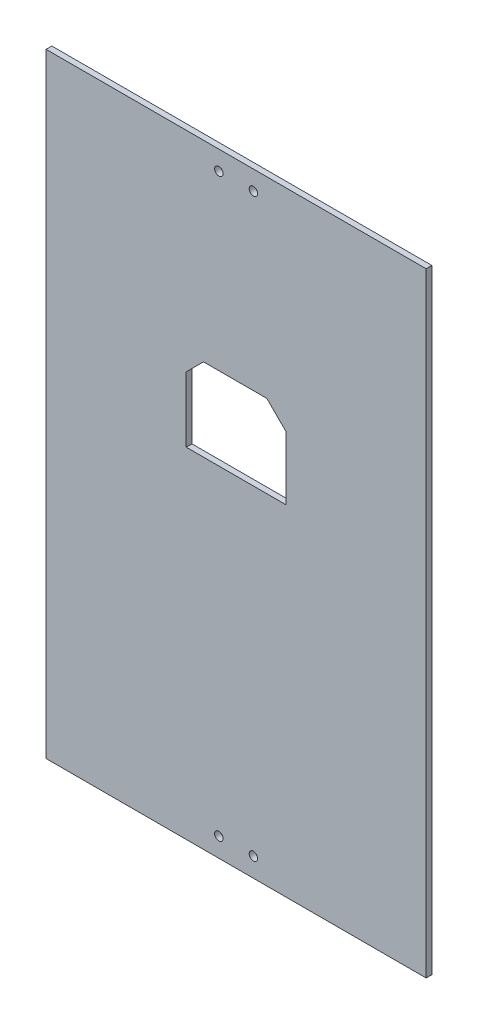
ISO-10303-21;
HEADER;
FILE_DESCRIPTION(('STEP AP214'),'2;1');
FILE_NAME('part.step','',(''),(''),'','','');
FILE_SCHEMA(('AUTOMOTIVE_DESIGN { 1 0 10303 214 1 1 1 1 }'));
ENDSEC;
DATA;
#1=APPLICATION_CONTEXT('core data for automotive mechanical design processes');
#2=APPLICATION_PROTOCOL_DEFINITION('international standard','automotive_design',2000,#1);
#3=PRODUCT_CONTEXT('',#1,'mechanical');
#4=PRODUCT('Part','Part','',(#3));
#5=PRODUCT_RELATED_PRODUCT_CATEGORY('part','',(#4));
#6=PRODUCT_DEFINITION_FORMATION('','',#4);
#7=PRODUCT_DEFINITION_CONTEXT('part definition',#1,'design');
#8=PRODUCT_DEFINITION('design','',#6,#7);
#9=PRODUCT_DEFINITION_SHAPE('','',#8);
#10=(LENGTH_UNIT() NAMED_UNIT(*) SI_UNIT(.MILLI.,.METRE.));
#11=(NAMED_UNIT(*) PLANE_ANGLE_UNIT() SI_UNIT($,.RADIAN.));
#12=(NAMED_UNIT(*) SI_UNIT($,.STERADIAN.) SOLID_ANGLE_UNIT());
#13=UNCERTAINTY_MEASURE_WITH_UNIT(LENGTH_MEASURE(1.E-05),#10,'distance_accuracy_value','');
#14=(GEOMETRIC_REPRESENTATION_CONTEXT(3) GLOBAL_UNCERTAINTY_ASSIGNED_CONTEXT((#13)) GLOBAL_UNIT_ASSIGNED_CONTEXT((#10,
#11,#12)) REPRESENTATION_CONTEXT('',''));
#15=CARTESIAN_POINT('',(0.,0.,0.));
#16=DIRECTION('',(0.,0.,1.));
#17=DIRECTION('',(1.,0.,0.));
#18=AXIS2_PLACEMENT_3D('',#15,#16,#17);
#19=CARTESIAN_POINT('',(-99.,165.,3.));
#20=DIRECTION('',(1.,0.,0.));
#21=DIRECTION('',(0.,1.,0.));
#22=AXIS2_PLACEMENT_3D('',#19,#20,#21);
#23=PLANE('',#22);
#24=DIRECTION('',(0.,-1.,0.));
#25=VECTOR('',#24,1.);
#26=CARTESIAN_POINT('',(-99.,165.,0.));
#27=LINE('',#26,#25);
#28=CARTESIAN_POINT('',(-99.,165.,0.));
#29=VERTEX_POINT('',#28);
#30=CARTESIAN_POINT('',(-99.,-155.,0.));
#31=VERTEX_POINT('',#30);
#32=EDGE_CURVE('E182',#29,#31,#27,.T.);
#33=ORIENTED_EDGE('',*,*,#32,.T.);
#34=DIRECTION('',(0.,0.,-1.));
#35=VECTOR('',#34,1.);
#36=CARTESIAN_POINT('',(-99.,-155.,3.));
#37=LINE('',#36,#35);
#38=CARTESIAN_POINT('',(-99.,-155.,3.));
#39=VERTEX_POINT('',#38);
#40=EDGE_CURVE('E11',#39,#31,#37,.T.);
#41=ORIENTED_EDGE('',*,*,#40,.F.);
#42=DIRECTION('',(0.,-1.,0.));
#43=VECTOR('',#42,1.);
#44=CARTESIAN_POINT('',(-99.,165.,3.));
#45=LINE('',#44,#43);
#46=CARTESIAN_POINT('',(-99.,165.,3.));
#47=VERTEX_POINT('',#46);
#48=EDGE_CURVE('E185',#47,#39,#45,.T.);
#49=ORIENTED_EDGE('',*,*,#48,.F.);
#50=DIRECTION('',(0.,0.,-1.));
#51=VECTOR('',#50,1.);
#52=CARTESIAN_POINT('',(-99.,165.,3.));
#53=LINE('',#52,#51);
#54=EDGE_CURVE('E195',#47,#29,#53,.T.);
#55=ORIENTED_EDGE('',*,*,#54,.T.);
#56=EDGE_LOOP('',(#33,#41,#49,#55));
#57=FACE_BOUND('',#56,.T.);
#58=ADVANCED_FACE('F39',(#57),#23,.F.);
#59=CARTESIAN_POINT('',(99.,-155.,3.));
#60=DIRECTION('',(0.,1.,0.));
#61=DIRECTION('',(-1.,0.,0.));
#62=AXIS2_PLACEMENT_3D('',#59,#60,#61);
#63=PLANE('',#62);
#64=DIRECTION('',(1.,0.,0.));
#65=VECTOR('',#64,1.);
#66=CARTESIAN_POINT('',(99.,-155.,0.));
#67=LINE('',#66,#65);
#68=CARTESIAN_POINT('',(99.,-155.,0.));
#69=VERTEX_POINT('',#68);
#70=EDGE_CURVE('E198',#31,#69,#67,.T.);
#71=ORIENTED_EDGE('',*,*,#70,.T.);
#72=DIRECTION('',(0.,0.,-1.));
#73=VECTOR('',#72,1.);
#74=CARTESIAN_POINT('',(99.,-155.,3.));
#75=LINE('',#74,#73);
#76=CARTESIAN_POINT('',(99.,-155.,3.));
#77=VERTEX_POINT('',#76);
#78=EDGE_CURVE('E46',#77,#69,#75,.T.);
#79=ORIENTED_EDGE('',*,*,#78,.F.);
#80=DIRECTION('',(1.,0.,0.));
#81=VECTOR('',#80,1.);
#82=CARTESIAN_POINT('',(99.,-155.,3.));
#83=LINE('',#82,#81);
#84=EDGE_CURVE('E188',#39,#77,#83,.T.);
#85=ORIENTED_EDGE('',*,*,#84,.F.);
#86=ORIENTED_EDGE('',*,*,#40,.T.);
#87=EDGE_LOOP('',(#71,#79,#85,#86));
#88=FACE_BOUND('',#87,.T.);
#89=ADVANCED_FACE('F227',(#88),#63,.F.);
#90=CARTESIAN_POINT('',(99.,165.,3.));
#91=DIRECTION('',(-1.,0.,0.));
#92=DIRECTION('',(0.,-1.,0.));
#93=AXIS2_PLACEMENT_3D('',#90,#91,#92);
#94=PLANE('',#93);
#95=DIRECTION('',(0.,1.,0.));
#96=VECTOR('',#95,1.);
#97=CARTESIAN_POINT('',(99.,165.,0.));
#98=LINE('',#97,#96);
#99=CARTESIAN_POINT('',(99.,165.,0.));
#100=VERTEX_POINT('',#99);
#101=EDGE_CURVE('E200',#69,#100,#98,.T.);
#102=ORIENTED_EDGE('',*,*,#101,.T.);
#103=DIRECTION('',(0.,0.,-1.));
#104=VECTOR('',#103,1.);
#105=CARTESIAN_POINT('',(99.,165.,3.));
#106=LINE('',#105,#104);
#107=CARTESIAN_POINT('',(99.,165.,3.));
#108=VERTEX_POINT('',#107);
#109=EDGE_CURVE('E205',#108,#100,#106,.T.);
#110=ORIENTED_EDGE('',*,*,#109,.F.);
#111=DIRECTION('',(0.,1.,0.));
#112=VECTOR('',#111,1.);
#113=CARTESIAN_POINT('',(99.,165.,3.));
#114=LINE('',#113,#112);
#115=EDGE_CURVE('E191',#77,#108,#114,.T.);
#116=ORIENTED_EDGE('',*,*,#115,.F.);
#117=ORIENTED_EDGE('',*,*,#78,.T.);
#118=EDGE_LOOP('',(#102,#110,#116,#117));
#119=FACE_BOUND('',#118,.T.);
#120=ADVANCED_FACE('F212',(#119),#94,.F.);
#121=CARTESIAN_POINT('',(-99.,165.,3.));
#122=DIRECTION('',(0.,-1.,0.));
#123=DIRECTION('',(0.,0.,-1.));
#124=AXIS2_PLACEMENT_3D('',#121,#122,#123);
#125=PLANE('',#124);
#126=DIRECTION('',(-1.,0.,0.));
#127=VECTOR('',#126,1.);
#128=CARTESIAN_POINT('',(-99.,165.,0.));
#129=LINE('',#128,#127);
#130=EDGE_CURVE('E189',#100,#29,#129,.T.);
#131=ORIENTED_EDGE('',*,*,#130,.T.);
#132=ORIENTED_EDGE('',*,*,#54,.F.);
#133=DIRECTION('',(-1.,0.,0.));
#134=VECTOR('',#133,1.);
#135=CARTESIAN_POINT('',(-99.,165.,3.));
#136=LINE('',#135,#134);
#137=EDGE_CURVE('E193',#108,#47,#136,.T.);
#138=ORIENTED_EDGE('',*,*,#137,.F.);
#139=ORIENTED_EDGE('',*,*,#109,.T.);
#140=EDGE_LOOP('',(#131,#132,#138,#139));
#141=FACE_BOUND('',#140,.T.);
#142=ADVANCED_FACE('F220',(#141),#125,.F.);
#143=CARTESIAN_POINT('',(0.,0.,3.));
#144=DIRECTION('',(0.,0.,-1.));
#145=DIRECTION('',(-1.,0.,0.));
#146=AXIS2_PLACEMENT_3D('',#143,#144,#145);
#147=PLANE('',#146);
#148=DIRECTION('',(1.,0.,0.));
#149=VECTOR('',#148,1.);
#150=CARTESIAN_POINT('',(0.,22.,3.));
#151=LINE('',#150,#149);
#152=CARTESIAN_POINT('',(-26.,22.,3.));
#153=VERTEX_POINT('',#152);
#154=CARTESIAN_POINT('',(26.,22.,3.));
#155=VERTEX_POINT('',#154);
#156=EDGE_CURVE('E133',#153,#155,#151,.T.);
#157=ORIENTED_EDGE('',*,*,#156,.F.);
#158=DIRECTION('',(0.,-1.,0.));
#159=VECTOR('',#158,1.);
#160=CARTESIAN_POINT('',(-26.,22.,3.));
#161=LINE('',#160,#159);
#162=CARTESIAN_POINT('',(-26.,56.,3.));
#163=VERTEX_POINT('',#162);
#164=EDGE_CURVE('E53',#163,#153,#161,.T.);
#165=ORIENTED_EDGE('',*,*,#164,.F.);
#166=DIRECTION('',(-0.707106781186548,-0.707106781186547,0.));
#167=VECTOR('',#166,1.);
#168=CARTESIAN_POINT('',(-17.,65.,3.));
#169=LINE('',#168,#167);
#170=CARTESIAN_POINT('',(-17.,65.,3.));
#171=VERTEX_POINT('',#170);
#172=EDGE_CURVE('E149',#171,#163,#169,.T.);
#173=ORIENTED_EDGE('',*,*,#172,.F.);
#174=DIRECTION('',(-1.,0.,0.));
#175=VECTOR('',#174,1.);
#176=CARTESIAN_POINT('',(16.,65.,3.));
#177=LINE('',#176,#175);
#178=CARTESIAN_POINT('',(16.,65.,3.));
#179=VERTEX_POINT('',#178);
#180=EDGE_CURVE('E146',#179,#171,#177,.T.);
#181=ORIENTED_EDGE('',*,*,#180,.F.);
#182=DIRECTION('',(-0.707106781186547,0.707106781186547,0.));
#183=VECTOR('',#182,1.);
#184=CARTESIAN_POINT('',(26.,55.,3.));
#185=LINE('',#184,#183);
#186=CARTESIAN_POINT('',(26.,55.,3.));
#187=VERTEX_POINT('',#186);
#188=EDGE_CURVE('E143',#187,#179,#185,.T.);
#189=ORIENTED_EDGE('',*,*,#188,.F.);
#190=DIRECTION('',(0.,1.,0.));
#191=VECTOR('',#190,1.);
#192=CARTESIAN_POINT('',(26.,22.,3.));
#193=LINE('',#192,#191);
#194=EDGE_CURVE('E135',#155,#187,#193,.T.);
#195=ORIENTED_EDGE('',*,*,#194,.F.);
#196=EDGE_LOOP('',(#157,#165,#173,#181,#189,#195));
#197=FACE_BOUND('',#196,.T.);
#198=CARTESIAN_POINT('',(9.,155.,3.));
#199=DIRECTION('',(0.,0.,1.));
#200=DIRECTION('',(1.,0.,0.));
#201=AXIS2_PLACEMENT_3D('',#198,#199,#200);
#202=CIRCLE('',#201,2.2);
#203=CARTESIAN_POINT('',(11.2,155.,3.));
#204=VERTEX_POINT('',#203);
#205=EDGE_CURVE('E174',#204,#204,#202,.T.);
#206=ORIENTED_EDGE('',*,*,#205,.F.);
#207=EDGE_LOOP('',(#206));
#208=FACE_BOUND('',#207,.T.);
#209=CARTESIAN_POINT('',(-9.,155.,3.));
#210=DIRECTION('',(0.,0.,1.));
#211=DIRECTION('',(1.,0.,0.));
#212=AXIS2_PLACEMENT_3D('',#209,#210,#211);
#213=CIRCLE('',#212,2.2);
#214=CARTESIAN_POINT('',(-6.8,155.,3.));
#215=VERTEX_POINT('',#214);
#216=EDGE_CURVE('E168',#215,#215,#213,.T.);
#217=ORIENTED_EDGE('',*,*,#216,.F.);
#218=EDGE_LOOP('',(#217));
#219=FACE_BOUND('',#218,.T.);
#220=CARTESIAN_POINT('',(-9.,-145.,3.));
#221=DIRECTION('',(0.,0.,1.));
#222=DIRECTION('',(1.,0.,0.));
#223=AXIS2_PLACEMENT_3D('',#220,#221,#222);
#224=CIRCLE('',#223,2.2);
#225=CARTESIAN_POINT('',(-6.8,-145.,3.));
#226=VERTEX_POINT('',#225);
#227=EDGE_CURVE('E161',#226,#226,#224,.T.);
#228=ORIENTED_EDGE('',*,*,#227,.F.);
#229=EDGE_LOOP('',(#228));
#230=FACE_BOUND('',#229,.T.);
#231=CARTESIAN_POINT('',(9.,-145.,3.));
#232=DIRECTION('',(0.,0.,1.));
#233=DIRECTION('',(1.,0.,0.));
#234=AXIS2_PLACEMENT_3D('',#231,#232,#233);
#235=CIRCLE('',#234,2.2);
#236=CARTESIAN_POINT('',(11.2,-145.,3.));
#237=VERTEX_POINT('',#236);
#238=EDGE_CURVE('E179',#237,#237,#235,.T.);
#239=ORIENTED_EDGE('',*,*,#238,.F.);
#240=EDGE_LOOP('',(#239));
#241=FACE_BOUND('',#240,.T.);
#242=ORIENTED_EDGE('',*,*,#48,.T.);
#243=ORIENTED_EDGE('',*,*,#84,.T.);
#244=ORIENTED_EDGE('',*,*,#115,.T.);
#245=ORIENTED_EDGE('',*,*,#137,.T.);
#246=EDGE_LOOP('',(#242,#243,#244,#245));
#247=FACE_BOUND('',#246,.T.);
#248=ADVANCED_FACE('F226',(#197,#208,#219,#230,#241,#247),#147,.F.);
#249=CARTESIAN_POINT('',(0.,0.,0.));
#250=DIRECTION('',(0.,0.,-1.));
#251=DIRECTION('',(-1.,0.,0.));
#252=AXIS2_PLACEMENT_3D('',#249,#250,#251);
#253=PLANE('',#252);
#254=DIRECTION('',(0.,-1.,0.));
#255=VECTOR('',#254,1.);
#256=CARTESIAN_POINT('',(-26.,22.,0.));
#257=LINE('',#256,#255);
#258=CARTESIAN_POINT('',(-26.,56.,0.));
#259=VERTEX_POINT('',#258);
#260=CARTESIAN_POINT('',(-26.,22.,0.));
#261=VERTEX_POINT('',#260);
#262=EDGE_CURVE('E124',#259,#261,#257,.T.);
#263=ORIENTED_EDGE('',*,*,#262,.T.);
#264=DIRECTION('',(1.,0.,0.));
#265=VECTOR('',#264,1.);
#266=CARTESIAN_POINT('',(0.,22.,0.));
#267=LINE('',#266,#265);
#268=CARTESIAN_POINT('',(26.,22.,0.));
#269=VERTEX_POINT('',#268);
#270=EDGE_CURVE('E114',#261,#269,#267,.T.);
#271=ORIENTED_EDGE('',*,*,#270,.T.);
#272=DIRECTION('',(0.,1.,0.));
#273=VECTOR('',#272,1.);
#274=CARTESIAN_POINT('',(26.,22.,0.));
#275=LINE('',#274,#273);
#276=CARTESIAN_POINT('',(26.,55.,0.));
#277=VERTEX_POINT('',#276);
#278=EDGE_CURVE('E386',#269,#277,#275,.T.);
#279=ORIENTED_EDGE('',*,*,#278,.T.);
#280=DIRECTION('',(-0.707106781186548,0.707106781186548,0.));
#281=VECTOR('',#280,1.);
#282=CARTESIAN_POINT('',(26.,55.,0.));
#283=LINE('',#282,#281);
#284=CARTESIAN_POINT('',(16.,65.,0.));
#285=VERTEX_POINT('',#284);
#286=EDGE_CURVE('E388',#277,#285,#283,.T.);
#287=ORIENTED_EDGE('',*,*,#286,.T.);
#288=DIRECTION('',(-1.,0.,0.));
#289=VECTOR('',#288,1.);
#290=CARTESIAN_POINT('',(16.,65.,0.));
#291=LINE('',#290,#289);
#292=CARTESIAN_POINT('',(-17.,65.,0.));
#293=VERTEX_POINT('',#292);
#294=EDGE_CURVE('E137',#285,#293,#291,.T.);
#295=ORIENTED_EDGE('',*,*,#294,.T.);
#296=DIRECTION('',(-0.707106781186548,-0.707106781186547,0.));
#297=VECTOR('',#296,1.);
#298=CARTESIAN_POINT('',(-17.,65.,0.));
#299=LINE('',#298,#297);
#300=EDGE_CURVE('E132',#293,#259,#299,.T.);
#301=ORIENTED_EDGE('',*,*,#300,.T.);
#302=EDGE_LOOP('',(#263,#271,#279,#287,#295,#301));
#303=FACE_BOUND('',#302,.T.);
#304=CARTESIAN_POINT('',(9.,155.,0.));
#305=DIRECTION('',(0.,0.,-1.));
#306=DIRECTION('',(-1.,0.,0.));
#307=AXIS2_PLACEMENT_3D('',#304,#305,#306);
#308=CIRCLE('',#307,2.2);
#309=CARTESIAN_POINT('',(11.2,155.,0.));
#310=VERTEX_POINT('',#309);
#311=EDGE_CURVE('E121',#310,#310,#308,.F.);
#312=ORIENTED_EDGE('',*,*,#311,.T.);
#313=EDGE_LOOP('',(#312));
#314=FACE_BOUND('',#313,.T.);
#315=CARTESIAN_POINT('',(-9.,155.,0.));
#316=DIRECTION('',(0.,0.,-1.));
#317=DIRECTION('',(-1.,0.,0.));
#318=AXIS2_PLACEMENT_3D('',#315,#316,#317);
#319=CIRCLE('',#318,2.2);
#320=CARTESIAN_POINT('',(-6.8,155.,0.));
#321=VERTEX_POINT('',#320);
#322=EDGE_CURVE('E171',#321,#321,#319,.F.);
#323=ORIENTED_EDGE('',*,*,#322,.T.);
#324=EDGE_LOOP('',(#323));
#325=FACE_BOUND('',#324,.T.);
#326=CARTESIAN_POINT('',(-9.,-145.,0.));
#327=DIRECTION('',(0.,0.,-1.));
#328=DIRECTION('',(-1.,0.,0.));
#329=AXIS2_PLACEMENT_3D('',#326,#327,#328);
#330=CIRCLE('',#329,2.2);
#331=CARTESIAN_POINT('',(-6.8,-145.,0.));
#332=VERTEX_POINT('',#331);
#333=EDGE_CURVE('E165',#332,#332,#330,.F.);
#334=ORIENTED_EDGE('',*,*,#333,.T.);
#335=EDGE_LOOP('',(#334));
#336=FACE_BOUND('',#335,.T.);
#337=CARTESIAN_POINT('',(9.,-145.,0.));
#338=DIRECTION('',(0.,0.,-1.));
#339=DIRECTION('',(-1.,0.,0.));
#340=AXIS2_PLACEMENT_3D('',#337,#338,#339);
#341=CIRCLE('',#340,2.2);
#342=CARTESIAN_POINT('',(11.2,-145.,0.));
#343=VERTEX_POINT('',#342);
#344=EDGE_CURVE('E164',#343,#343,#341,.F.);
#345=ORIENTED_EDGE('',*,*,#344,.T.);
#346=EDGE_LOOP('',(#345));
#347=FACE_BOUND('',#346,.T.);
#348=ORIENTED_EDGE('',*,*,#32,.F.);
#349=ORIENTED_EDGE('',*,*,#130,.F.);
#350=ORIENTED_EDGE('',*,*,#101,.F.);
#351=ORIENTED_EDGE('',*,*,#70,.F.);
#352=EDGE_LOOP('',(#348,#349,#350,#351));
#353=FACE_BOUND('',#352,.T.);
#354=ADVANCED_FACE('F129',(#303,#314,#325,#336,#347,#353),#253,.T.);
#355=CARTESIAN_POINT('',(9.,-145.,-0.00100000000000013));
#356=DIRECTION('',(0.,0.,1.));
#357=DIRECTION('',(1.,0.,0.));
#358=AXIS2_PLACEMENT_3D('',#355,#356,#357);
#359=CYLINDRICAL_SURFACE('',#358,2.2);
#360=CARTESIAN_POINT('',(11.2,-145.,0.));
#361=CARTESIAN_POINT('',(11.2,-145.,0.03125));
#362=CARTESIAN_POINT('',(11.2,-145.,0.0625));
#363=CARTESIAN_POINT('',(11.2,-145.,0.125));
#364=CARTESIAN_POINT('',(11.2,-145.,0.15625));
#365=CARTESIAN_POINT('',(11.2,-145.,0.21875));
#366=CARTESIAN_POINT('',(11.2,-145.,0.25));
#367=CARTESIAN_POINT('',(11.2,-145.,0.3125));
#368=CARTESIAN_POINT('',(11.2,-145.,0.34375));
#369=CARTESIAN_POINT('',(11.2,-145.,0.40625));
#370=CARTESIAN_POINT('',(11.2,-145.,0.4375));
#371=CARTESIAN_POINT('',(11.2,-145.,0.5));
#372=CARTESIAN_POINT('',(11.2,-145.,0.53125));
#373=CARTESIAN_POINT('',(11.2,-145.,0.59375));
#374=CARTESIAN_POINT('',(11.2,-145.,0.625));
#375=CARTESIAN_POINT('',(11.2,-145.,0.6875));
#376=CARTESIAN_POINT('',(11.2,-145.,0.71875));
#377=CARTESIAN_POINT('',(11.2,-145.,0.78125));
#378=CARTESIAN_POINT('',(11.2,-145.,0.8125));
#379=CARTESIAN_POINT('',(11.2,-145.,0.875));
#380=CARTESIAN_POINT('',(11.2,-145.,0.90625));
#381=CARTESIAN_POINT('',(11.2,-145.,0.96875));
#382=CARTESIAN_POINT('',(11.2,-145.,1.));
#383=CARTESIAN_POINT('',(11.2,-145.,1.0625));
#384=CARTESIAN_POINT('',(11.2,-145.,1.09375));
#385=CARTESIAN_POINT('',(11.2,-145.,1.15625));
#386=CARTESIAN_POINT('',(11.2,-145.,1.1875));
#387=CARTESIAN_POINT('',(11.2,-145.,1.25));
#388=CARTESIAN_POINT('',(11.2,-145.,1.28125));
#389=CARTESIAN_POINT('',(11.2,-145.,1.34375));
#390=CARTESIAN_POINT('',(11.2,-145.,1.375));
#391=CARTESIAN_POINT('',(11.2,-145.,1.4375));
#392=CARTESIAN_POINT('',(11.2,-145.,1.46875));
#393=CARTESIAN_POINT('',(11.2,-145.,1.53125));
#394=CARTESIAN_POINT('',(11.2,-145.,1.5625));
#395=CARTESIAN_POINT('',(11.2,-145.,1.625));
#396=CARTESIAN_POINT('',(11.2,-145.,1.65625));
#397=CARTESIAN_POINT('',(11.2,-145.,1.71875));
#398=CARTESIAN_POINT('',(11.2,-145.,1.75));
#399=CARTESIAN_POINT('',(11.2,-145.,1.8125));
#400=CARTESIAN_POINT('',(11.2,-145.,1.84375));
#401=CARTESIAN_POINT('',(11.2,-145.,1.90625));
#402=CARTESIAN_POINT('',(11.2,-145.,1.9375));
#403=CARTESIAN_POINT('',(11.2,-145.,2.));
#404=CARTESIAN_POINT('',(11.2,-145.,2.03125));
#405=CARTESIAN_POINT('',(11.2,-145.,2.09375));
#406=CARTESIAN_POINT('',(11.2,-145.,2.125));
#407=CARTESIAN_POINT('',(11.2,-145.,2.1875));
#408=CARTESIAN_POINT('',(11.2,-145.,2.21875));
#409=CARTESIAN_POINT('',(11.2,-145.,2.28125));
#410=CARTESIAN_POINT('',(11.2,-145.,2.3125));
#411=CARTESIAN_POINT('',(11.2,-145.,2.375));
#412=CARTESIAN_POINT('',(11.2,-145.,2.40625));
#413=CARTESIAN_POINT('',(11.2,-145.,2.46875));
#414=CARTESIAN_POINT('',(11.2,-145.,2.5));
#415=CARTESIAN_POINT('',(11.2,-145.,2.5625));
#416=CARTESIAN_POINT('',(11.2,-145.,2.59375));
#417=CARTESIAN_POINT('',(11.2,-145.,2.65625));
#418=CARTESIAN_POINT('',(11.2,-145.,2.6875));
#419=CARTESIAN_POINT('',(11.2,-145.,2.75));
#420=CARTESIAN_POINT('',(11.2,-145.,2.78125));
#421=CARTESIAN_POINT('',(11.2,-145.,2.84375));
#422=CARTESIAN_POINT('',(11.2,-145.,2.875));
#423=CARTESIAN_POINT('',(11.2,-145.,2.9375));
#424=CARTESIAN_POINT('',(11.2,-145.,2.96875));
#425=CARTESIAN_POINT('',(11.2,-145.,3.));
#426=B_SPLINE_CURVE_WITH_KNOTS('',3,(#360,#361,#362,#363,#364,#365,#366,#367,#368,#369,#370,
#371,#372,#373,#374,#375,#376,#377,#378,#379,#380,#381,#382,#383,#384,#385,#386,#387,#388,#389,
#390,#391,#392,#393,#394,#395,#396,#397,#398,#399,#400,#401,#402,#403,#404,#405,#406,#407,#408,
#409,#410,#411,#412,#413,#414,#415,#416,#417,#418,#419,#420,#421,#422,#423,#424,#425),
.UNSPECIFIED.,.F.,.F.,(4,2,2,2,2,2,2,2,2,2,2,2,2,2,2,2,2,2,2,2,2,2,2,2,2,2,2,2,2,2,2,2,4),(0.,
0.09375,0.1875,0.28125,0.375,0.46875,0.5625,0.65625,0.75,0.84375,0.9375,1.03125,1.125,1.21875,
1.3125,1.40625,1.5,1.59375,1.6875,1.78125,1.875,1.96875,2.0625,2.15625,2.25,2.34375,2.4375,
2.53125,2.625,2.71875,2.8125,2.90625,3.),.UNSPECIFIED.);
#427=EDGE_CURVE('BSEAM239',#343,#237,#426,.T.);
#428=ORIENTED_EDGE('',*,*,#344,.F.);
#429=ORIENTED_EDGE('',*,*,#238,.T.);
#430=ORIENTED_EDGE('',*,*,#427,.T.);
#431=ORIENTED_EDGE('',*,*,#427,.F.);
#432=EDGE_LOOP('',(#428,#430,#429,#431));
#433=FACE_BOUND('',#432,.T.);
#434=ADVANCED_FACE('F239',(#433),#359,.F.);
#435=CARTESIAN_POINT('',(-9.,-145.,-0.00100000000000013));
#436=DIRECTION('',(0.,0.,1.));
#437=DIRECTION('',(1.,0.,0.));
#438=AXIS2_PLACEMENT_3D('',#435,#436,#437);
#439=CYLINDRICAL_SURFACE('',#438,2.2);
#440=CARTESIAN_POINT('',(-6.8,-145.,0.));
#441=CARTESIAN_POINT('',(-6.8,-145.,0.03125));
#442=CARTESIAN_POINT('',(-6.8,-145.,0.0625));
#443=CARTESIAN_POINT('',(-6.8,-145.,0.125));
#444=CARTESIAN_POINT('',(-6.8,-145.,0.15625));
#445=CARTESIAN_POINT('',(-6.8,-145.,0.21875));
#446=CARTESIAN_POINT('',(-6.8,-145.,0.25));
#447=CARTESIAN_POINT('',(-6.8,-145.,0.3125));
#448=CARTESIAN_POINT('',(-6.8,-145.,0.34375));
#449=CARTESIAN_POINT('',(-6.8,-145.,0.40625));
#450=CARTESIAN_POINT('',(-6.8,-145.,0.4375));
#451=CARTESIAN_POINT('',(-6.8,-145.,0.5));
#452=CARTESIAN_POINT('',(-6.8,-145.,0.53125));
#453=CARTESIAN_POINT('',(-6.8,-145.,0.59375));
#454=CARTESIAN_POINT('',(-6.8,-145.,0.625));
#455=CARTESIAN_POINT('',(-6.8,-145.,0.6875));
#456=CARTESIAN_POINT('',(-6.8,-145.,0.71875));
#457=CARTESIAN_POINT('',(-6.8,-145.,0.78125));
#458=CARTESIAN_POINT('',(-6.8,-145.,0.8125));
#459=CARTESIAN_POINT('',(-6.8,-145.,0.875));
#460=CARTESIAN_POINT('',(-6.8,-145.,0.90625));
#461=CARTESIAN_POINT('',(-6.8,-145.,0.96875));
#462=CARTESIAN_POINT('',(-6.8,-145.,1.));
#463=CARTESIAN_POINT('',(-6.8,-145.,1.0625));
#464=CARTESIAN_POINT('',(-6.8,-145.,1.09375));
#465=CARTESIAN_POINT('',(-6.8,-145.,1.15625));
#466=CARTESIAN_POINT('',(-6.8,-145.,1.1875));
#467=CARTESIAN_POINT('',(-6.8,-145.,1.25));
#468=CARTESIAN_POINT('',(-6.8,-145.,1.28125));
#469=CARTESIAN_POINT('',(-6.8,-145.,1.34375));
#470=CARTESIAN_POINT('',(-6.8,-145.,1.375));
#471=CARTESIAN_POINT('',(-6.8,-145.,1.4375));
#472=CARTESIAN_POINT('',(-6.8,-145.,1.46875));
#473=CARTESIAN_POINT('',(-6.8,-145.,1.53125));
#474=CARTESIAN_POINT('',(-6.8,-145.,1.5625));
#475=CARTESIAN_POINT('',(-6.8,-145.,1.625));
#476=CARTESIAN_POINT('',(-6.8,-145.,1.65625));
#477=CARTESIAN_POINT('',(-6.8,-145.,1.71875));
#478=CARTESIAN_POINT('',(-6.8,-145.,1.75));
#479=CARTESIAN_POINT('',(-6.8,-145.,1.8125));
#480=CARTESIAN_POINT('',(-6.8,-145.,1.84375));
#481=CARTESIAN_POINT('',(-6.8,-145.,1.90625));
#482=CARTESIAN_POINT('',(-6.8,-145.,1.9375));
#483=CARTESIAN_POINT('',(-6.8,-145.,2.));
#484=CARTESIAN_POINT('',(-6.8,-145.,2.03125));
#485=CARTESIAN_POINT('',(-6.8,-145.,2.09375));
#486=CARTESIAN_POINT('',(-6.8,-145.,2.125));
#487=CARTESIAN_POINT('',(-6.8,-145.,2.1875));
#488=CARTESIAN_POINT('',(-6.8,-145.,2.21875));
#489=CARTESIAN_POINT('',(-6.8,-145.,2.28125));
#490=CARTESIAN_POINT('',(-6.8,-145.,2.3125));
#491=CARTESIAN_POINT('',(-6.8,-145.,2.375));
#492=CARTESIAN_POINT('',(-6.8,-145.,2.40625));
#493=CARTESIAN_POINT('',(-6.8,-145.,2.46875));
#494=CARTESIAN_POINT('',(-6.8,-145.,2.5));
#495=CARTESIAN_POINT('',(-6.8,-145.,2.5625));
#496=CARTESIAN_POINT('',(-6.8,-145.,2.59375));
#497=CARTESIAN_POINT('',(-6.8,-145.,2.65625));
#498=CARTESIAN_POINT('',(-6.8,-145.,2.6875));
#499=CARTESIAN_POINT('',(-6.8,-145.,2.75));
#500=CARTESIAN_POINT('',(-6.8,-145.,2.78125));
#501=CARTESIAN_POINT('',(-6.8,-145.,2.84375));
#502=CARTESIAN_POINT('',(-6.8,-145.,2.875));
#503=CARTESIAN_POINT('',(-6.8,-145.,2.9375));
#504=CARTESIAN_POINT('',(-6.8,-145.,2.96875));
#505=CARTESIAN_POINT('',(-6.8,-145.,3.));
#506=B_SPLINE_CURVE_WITH_KNOTS('',3,(#440,#441,#442,#443,#444,#445,#446,#447,#448,#449,#450,
#451,#452,#453,#454,#455,#456,#457,#458,#459,#460,#461,#462,#463,#464,#465,#466,#467,#468,#469,
#470,#471,#472,#473,#474,#475,#476,#477,#478,#479,#480,#481,#482,#483,#484,#485,#486,#487,#488,
#489,#490,#491,#492,#493,#494,#495,#496,#497,#498,#499,#500,#501,#502,#503,#504,#505),
.UNSPECIFIED.,.F.,.F.,(4,2,2,2,2,2,2,2,2,2,2,2,2,2,2,2,2,2,2,2,2,2,2,2,2,2,2,2,2,2,2,2,4),(0.,
0.09375,0.1875,0.28125,0.375,0.46875,0.5625,0.65625,0.75,0.84375,0.9375,1.03125,1.125,1.21875,
1.3125,1.40625,1.5,1.59375,1.6875,1.78125,1.875,1.96875,2.0625,2.15625,2.25,2.34375,2.4375,
2.53125,2.625,2.71875,2.8125,2.90625,3.),.UNSPECIFIED.);
#507=EDGE_CURVE('BSEAM245',#332,#226,#506,.T.);
#508=ORIENTED_EDGE('',*,*,#333,.F.);
#509=ORIENTED_EDGE('',*,*,#227,.T.);
#510=ORIENTED_EDGE('',*,*,#507,.T.);
#511=ORIENTED_EDGE('',*,*,#507,.F.);
#512=EDGE_LOOP('',(#508,#510,#509,#511));
#513=FACE_BOUND('',#512,.T.);
#514=ADVANCED_FACE('F245',(#513),#439,.F.);
#515=CARTESIAN_POINT('',(-9.,155.,-0.00100000000000013));
#516=DIRECTION('',(0.,0.,1.));
#517=DIRECTION('',(1.,0.,0.));
#518=AXIS2_PLACEMENT_3D('',#515,#516,#517);
#519=CYLINDRICAL_SURFACE('',#518,2.2);
#520=CARTESIAN_POINT('',(-6.8,155.,0.));
#521=CARTESIAN_POINT('',(-6.8,155.,0.03125));
#522=CARTESIAN_POINT('',(-6.8,155.,0.0625));
#523=CARTESIAN_POINT('',(-6.8,155.,0.125));
#524=CARTESIAN_POINT('',(-6.8,155.,0.15625));
#525=CARTESIAN_POINT('',(-6.8,155.,0.21875));
#526=CARTESIAN_POINT('',(-6.8,155.,0.25));
#527=CARTESIAN_POINT('',(-6.8,155.,0.3125));
#528=CARTESIAN_POINT('',(-6.8,155.,0.34375));
#529=CARTESIAN_POINT('',(-6.8,155.,0.40625));
#530=CARTESIAN_POINT('',(-6.8,155.,0.4375));
#531=CARTESIAN_POINT('',(-6.8,155.,0.5));
#532=CARTESIAN_POINT('',(-6.8,155.,0.53125));
#533=CARTESIAN_POINT('',(-6.8,155.,0.59375));
#534=CARTESIAN_POINT('',(-6.8,155.,0.625));
#535=CARTESIAN_POINT('',(-6.8,155.,0.6875));
#536=CARTESIAN_POINT('',(-6.8,155.,0.71875));
#537=CARTESIAN_POINT('',(-6.8,155.,0.78125));
#538=CARTESIAN_POINT('',(-6.8,155.,0.8125));
#539=CARTESIAN_POINT('',(-6.8,155.,0.875));
#540=CARTESIAN_POINT('',(-6.8,155.,0.90625));
#541=CARTESIAN_POINT('',(-6.8,155.,0.96875));
#542=CARTESIAN_POINT('',(-6.8,155.,1.));
#543=CARTESIAN_POINT('',(-6.8,155.,1.0625));
#544=CARTESIAN_POINT('',(-6.8,155.,1.09375));
#545=CARTESIAN_POINT('',(-6.8,155.,1.15625));
#546=CARTESIAN_POINT('',(-6.8,155.,1.1875));
#547=CARTESIAN_POINT('',(-6.8,155.,1.25));
#548=CARTESIAN_POINT('',(-6.8,155.,1.28125));
#549=CARTESIAN_POINT('',(-6.8,155.,1.34375));
#550=CARTESIAN_POINT('',(-6.8,155.,1.375));
#551=CARTESIAN_POINT('',(-6.8,155.,1.4375));
#552=CARTESIAN_POINT('',(-6.8,155.,1.46875));
#553=CARTESIAN_POINT('',(-6.8,155.,1.53125));
#554=CARTESIAN_POINT('',(-6.8,155.,1.5625));
#555=CARTESIAN_POINT('',(-6.8,155.,1.625));
#556=CARTESIAN_POINT('',(-6.8,155.,1.65625));
#557=CARTESIAN_POINT('',(-6.8,155.,1.71875));
#558=CARTESIAN_POINT('',(-6.8,155.,1.75));
#559=CARTESIAN_POINT('',(-6.8,155.,1.8125));
#560=CARTESIAN_POINT('',(-6.8,155.,1.84375));
#561=CARTESIAN_POINT('',(-6.8,155.,1.90625));
#562=CARTESIAN_POINT('',(-6.8,155.,1.9375));
#563=CARTESIAN_POINT('',(-6.8,155.,2.));
#564=CARTESIAN_POINT('',(-6.8,155.,2.03125));
#565=CARTESIAN_POINT('',(-6.8,155.,2.09375));
#566=CARTESIAN_POINT('',(-6.8,155.,2.125));
#567=CARTESIAN_POINT('',(-6.8,155.,2.1875));
#568=CARTESIAN_POINT('',(-6.8,155.,2.21875));
#569=CARTESIAN_POINT('',(-6.8,155.,2.28125));
#570=CARTESIAN_POINT('',(-6.8,155.,2.3125));
#571=CARTESIAN_POINT('',(-6.8,155.,2.375));
#572=CARTESIAN_POINT('',(-6.8,155.,2.40625));
#573=CARTESIAN_POINT('',(-6.8,155.,2.46875));
#574=CARTESIAN_POINT('',(-6.8,155.,2.5));
#575=CARTESIAN_POINT('',(-6.8,155.,2.5625));
#576=CARTESIAN_POINT('',(-6.8,155.,2.59375));
#577=CARTESIAN_POINT('',(-6.8,155.,2.65625));
#578=CARTESIAN_POINT('',(-6.8,155.,2.6875));
#579=CARTESIAN_POINT('',(-6.8,155.,2.75));
#580=CARTESIAN_POINT('',(-6.8,155.,2.78125));
#581=CARTESIAN_POINT('',(-6.8,155.,2.84375));
#582=CARTESIAN_POINT('',(-6.8,155.,2.875));
#583=CARTESIAN_POINT('',(-6.8,155.,2.9375));
#584=CARTESIAN_POINT('',(-6.8,155.,2.96875));
#585=CARTESIAN_POINT('',(-6.8,155.,3.));
#586=B_SPLINE_CURVE_WITH_KNOTS('',3,(#520,#521,#522,#523,#524,#525,#526,#527,#528,#529,#530,
#531,#532,#533,#534,#535,#536,#537,#538,#539,#540,#541,#542,#543,#544,#545,#546,#547,#548,#549,
#550,#551,#552,#553,#554,#555,#556,#557,#558,#559,#560,#561,#562,#563,#564,#565,#566,#567,#568,
#569,#570,#571,#572,#573,#574,#575,#576,#577,#578,#579,#580,#581,#582,#583,#584,#585),
.UNSPECIFIED.,.F.,.F.,(4,2,2,2,2,2,2,2,2,2,2,2,2,2,2,2,2,2,2,2,2,2,2,2,2,2,2,2,2,2,2,2,4),(0.,
0.09375,0.1875,0.28125,0.375,0.46875,0.5625,0.65625,0.75,0.84375,0.9375,1.03125,1.125,1.21875,
1.3125,1.40625,1.5,1.59375,1.6875,1.78125,1.875,1.96875,2.0625,2.15625,2.25,2.34375,2.4375,
2.53125,2.625,2.71875,2.8125,2.90625,3.),.UNSPECIFIED.);
#587=EDGE_CURVE('BSEAM250',#321,#215,#586,.T.);
#588=ORIENTED_EDGE('',*,*,#322,.F.);
#589=ORIENTED_EDGE('',*,*,#216,.T.);
#590=ORIENTED_EDGE('',*,*,#587,.T.);
#591=ORIENTED_EDGE('',*,*,#587,.F.);
#592=EDGE_LOOP('',(#588,#590,#589,#591));
#593=FACE_BOUND('',#592,.T.);
#594=ADVANCED_FACE('F250',(#593),#519,.F.);
#595=CARTESIAN_POINT('',(9.,155.,-0.00100000000000013));
#596=DIRECTION('',(0.,0.,1.));
#597=DIRECTION('',(1.,0.,0.));
#598=AXIS2_PLACEMENT_3D('',#595,#596,#597);
#599=CYLINDRICAL_SURFACE('',#598,2.2);
#600=CARTESIAN_POINT('',(11.2,155.,0.));
#601=CARTESIAN_POINT('',(11.2,155.,0.03125));
#602=CARTESIAN_POINT('',(11.2,155.,0.0625));
#603=CARTESIAN_POINT('',(11.2,155.,0.125));
#604=CARTESIAN_POINT('',(11.2,155.,0.15625));
#605=CARTESIAN_POINT('',(11.2,155.,0.21875));
#606=CARTESIAN_POINT('',(11.2,155.,0.25));
#607=CARTESIAN_POINT('',(11.2,155.,0.3125));
#608=CARTESIAN_POINT('',(11.2,155.,0.34375));
#609=CARTESIAN_POINT('',(11.2,155.,0.40625));
#610=CARTESIAN_POINT('',(11.2,155.,0.4375));
#611=CARTESIAN_POINT('',(11.2,155.,0.5));
#612=CARTESIAN_POINT('',(11.2,155.,0.53125));
#613=CARTESIAN_POINT('',(11.2,155.,0.59375));
#614=CARTESIAN_POINT('',(11.2,155.,0.625));
#615=CARTESIAN_POINT('',(11.2,155.,0.6875));
#616=CARTESIAN_POINT('',(11.2,155.,0.71875));
#617=CARTESIAN_POINT('',(11.2,155.,0.78125));
#618=CARTESIAN_POINT('',(11.2,155.,0.8125));
#619=CARTESIAN_POINT('',(11.2,155.,0.875));
#620=CARTESIAN_POINT('',(11.2,155.,0.90625));
#621=CARTESIAN_POINT('',(11.2,155.,0.96875));
#622=CARTESIAN_POINT('',(11.2,155.,1.));
#623=CARTESIAN_POINT('',(11.2,155.,1.0625));
#624=CARTESIAN_POINT('',(11.2,155.,1.09375));
#625=CARTESIAN_POINT('',(11.2,155.,1.15625));
#626=CARTESIAN_POINT('',(11.2,155.,1.1875));
#627=CARTESIAN_POINT('',(11.2,155.,1.25));
#628=CARTESIAN_POINT('',(11.2,155.,1.28125));
#629=CARTESIAN_POINT('',(11.2,155.,1.34375));
#630=CARTESIAN_POINT('',(11.2,155.,1.375));
#631=CARTESIAN_POINT('',(11.2,155.,1.4375));
#632=CARTESIAN_POINT('',(11.2,155.,1.46875));
#633=CARTESIAN_POINT('',(11.2,155.,1.53125));
#634=CARTESIAN_POINT('',(11.2,155.,1.5625));
#635=CARTESIAN_POINT('',(11.2,155.,1.625));
#636=CARTESIAN_POINT('',(11.2,155.,1.65625));
#637=CARTESIAN_POINT('',(11.2,155.,1.71875));
#638=CARTESIAN_POINT('',(11.2,155.,1.75));
#639=CARTESIAN_POINT('',(11.2,155.,1.8125));
#640=CARTESIAN_POINT('',(11.2,155.,1.84375));
#641=CARTESIAN_POINT('',(11.2,155.,1.90625));
#642=CARTESIAN_POINT('',(11.2,155.,1.9375));
#643=CARTESIAN_POINT('',(11.2,155.,2.));
#644=CARTESIAN_POINT('',(11.2,155.,2.03125));
#645=CARTESIAN_POINT('',(11.2,155.,2.09375));
#646=CARTESIAN_POINT('',(11.2,155.,2.125));
#647=CARTESIAN_POINT('',(11.2,155.,2.1875));
#648=CARTESIAN_POINT('',(11.2,155.,2.21875));
#649=CARTESIAN_POINT('',(11.2,155.,2.28125));
#650=CARTESIAN_POINT('',(11.2,155.,2.3125));
#651=CARTESIAN_POINT('',(11.2,155.,2.375));
#652=CARTESIAN_POINT('',(11.2,155.,2.40625));
#653=CARTESIAN_POINT('',(11.2,155.,2.46875));
#654=CARTESIAN_POINT('',(11.2,155.,2.5));
#655=CARTESIAN_POINT('',(11.2,155.,2.5625));
#656=CARTESIAN_POINT('',(11.2,155.,2.59375));
#657=CARTESIAN_POINT('',(11.2,155.,2.65625));
#658=CARTESIAN_POINT('',(11.2,155.,2.6875));
#659=CARTESIAN_POINT('',(11.2,155.,2.75));
#660=CARTESIAN_POINT('',(11.2,155.,2.78125));
#661=CARTESIAN_POINT('',(11.2,155.,2.84375));
#662=CARTESIAN_POINT('',(11.2,155.,2.875));
#663=CARTESIAN_POINT('',(11.2,155.,2.9375));
#664=CARTESIAN_POINT('',(11.2,155.,2.96875));
#665=CARTESIAN_POINT('',(11.2,155.,3.));
#666=B_SPLINE_CURVE_WITH_KNOTS('',3,(#600,#601,#602,#603,#604,#605,#606,#607,#608,#609,#610,
#611,#612,#613,#614,#615,#616,#617,#618,#619,#620,#621,#622,#623,#624,#625,#626,#627,#628,#629,
#630,#631,#632,#633,#634,#635,#636,#637,#638,#639,#640,#641,#642,#643,#644,#645,#646,#647,#648,
#649,#650,#651,#652,#653,#654,#655,#656,#657,#658,#659,#660,#661,#662,#663,#664,#665),
.UNSPECIFIED.,.F.,.F.,(4,2,2,2,2,2,2,2,2,2,2,2,2,2,2,2,2,2,2,2,2,2,2,2,2,2,2,2,2,2,2,2,4),(0.,
0.09375,0.1875,0.28125,0.375,0.46875,0.5625,0.65625,0.75,0.84375,0.9375,1.03125,1.125,1.21875,
1.3125,1.40625,1.5,1.59375,1.6875,1.78125,1.875,1.96875,2.0625,2.15625,2.25,2.34375,2.4375,
2.53125,2.625,2.71875,2.8125,2.90625,3.),.UNSPECIFIED.);
#667=EDGE_CURVE('BSEAM247',#310,#204,#666,.T.);
#668=ORIENTED_EDGE('',*,*,#311,.F.);
#669=ORIENTED_EDGE('',*,*,#205,.T.);
#670=ORIENTED_EDGE('',*,*,#667,.T.);
#671=ORIENTED_EDGE('',*,*,#667,.F.);
#672=EDGE_LOOP('',(#668,#670,#669,#671));
#673=FACE_BOUND('',#672,.T.);
#674=ADVANCED_FACE('F247',(#673),#599,.F.);
#675=CARTESIAN_POINT('',(-26.,22.,-0.00100000000000013));
#676=DIRECTION('',(-1.,0.,0.));
#677=DIRECTION('',(0.,0.,1.));
#678=AXIS2_PLACEMENT_3D('',#675,#676,#677);
#679=PLANE('',#678);
#680=DIRECTION('',(0.,0.,1.));
#681=VECTOR('',#680,1.);
#682=CARTESIAN_POINT('',(-26.,56.,-0.00100000000000013));
#683=LINE('',#682,#681);
#684=EDGE_CURVE('E126',#259,#163,#683,.T.);
#685=ORIENTED_EDGE('',*,*,#684,.T.);
#686=ORIENTED_EDGE('',*,*,#164,.T.);
#687=DIRECTION('',(0.,0.,1.));
#688=VECTOR('',#687,1.);
#689=CARTESIAN_POINT('',(-26.,22.,-0.00100000000000013));
#690=LINE('',#689,#688);
#691=EDGE_CURVE('E116',#261,#153,#690,.T.);
#692=ORIENTED_EDGE('',*,*,#691,.F.);
#693=ORIENTED_EDGE('',*,*,#262,.F.);
#694=EDGE_LOOP('',(#685,#686,#692,#693));
#695=FACE_BOUND('',#694,.T.);
#696=ADVANCED_FACE('F123',(#695),#679,.F.);
#697=CARTESIAN_POINT('',(-17.,65.,-0.00100000000000013));
#698=DIRECTION('',(-0.707106781186547,0.707106781186548,0.));
#699=DIRECTION('',(-0.707106781186548,-0.707106781186547,0.));
#700=AXIS2_PLACEMENT_3D('',#697,#698,#699);
#701=PLANE('',#700);
#702=DIRECTION('',(0.,0.,1.));
#703=VECTOR('',#702,1.);
#704=CARTESIAN_POINT('',(-17.,65.,-0.00100000000000013));
#705=LINE('',#704,#703);
#706=EDGE_CURVE('E154',#293,#171,#705,.T.);
#707=ORIENTED_EDGE('',*,*,#706,.T.);
#708=ORIENTED_EDGE('',*,*,#172,.T.);
#709=ORIENTED_EDGE('',*,*,#684,.F.);
#710=ORIENTED_EDGE('',*,*,#300,.F.);
#711=EDGE_LOOP('',(#707,#708,#709,#710));
#712=FACE_BOUND('',#711,.T.);
#713=ADVANCED_FACE('F271',(#712),#701,.F.);
#714=CARTESIAN_POINT('',(16.,65.,-0.00100000000000013));
#715=DIRECTION('',(0.,1.,0.));
#716=DIRECTION('',(-1.,0.,0.));
#717=AXIS2_PLACEMENT_3D('',#714,#715,#716);
#718=PLANE('',#717);
#719=DIRECTION('',(0.,0.,1.));
#720=VECTOR('',#719,1.);
#721=CARTESIAN_POINT('',(16.,65.,-0.00100000000000013));
#722=LINE('',#721,#720);
#723=EDGE_CURVE('E156',#285,#179,#722,.T.);
#724=ORIENTED_EDGE('',*,*,#723,.T.);
#725=ORIENTED_EDGE('',*,*,#180,.T.);
#726=ORIENTED_EDGE('',*,*,#706,.F.);
#727=ORIENTED_EDGE('',*,*,#294,.F.);
#728=EDGE_LOOP('',(#724,#725,#726,#727));
#729=FACE_BOUND('',#728,.T.);
#730=ADVANCED_FACE('F267',(#729),#718,.F.);
#731=CARTESIAN_POINT('',(26.,55.,-0.00100000000000013));
#732=DIRECTION('',(0.707106781186547,0.707106781186547,0.));
#733=DIRECTION('',(-0.707106781186548,0.707106781186548,0.));
#734=AXIS2_PLACEMENT_3D('',#731,#732,#733);
#735=PLANE('',#734);
#736=DIRECTION('',(0.,0.,1.));
#737=VECTOR('',#736,1.);
#738=CARTESIAN_POINT('',(26.,55.,-0.00100000000000013));
#739=LINE('',#738,#737);
#740=EDGE_CURVE('E158',#277,#187,#739,.T.);
#741=ORIENTED_EDGE('',*,*,#740,.T.);
#742=ORIENTED_EDGE('',*,*,#188,.T.);
#743=ORIENTED_EDGE('',*,*,#723,.F.);
#744=ORIENTED_EDGE('',*,*,#286,.F.);
#745=EDGE_LOOP('',(#741,#742,#743,#744));
#746=FACE_BOUND('',#745,.T.);
#747=ADVANCED_FACE('F263',(#746),#735,.F.);
#748=CARTESIAN_POINT('',(26.,22.,-0.00100000000000013));
#749=DIRECTION('',(1.,0.,0.));
#750=DIRECTION('',(0.,0.,-1.));
#751=AXIS2_PLACEMENT_3D('',#748,#749,#750);
#752=PLANE('',#751);
#753=DIRECTION('',(0.,0.,1.));
#754=VECTOR('',#753,1.);
#755=CARTESIAN_POINT('',(26.,22.,-0.00100000000000013));
#756=LINE('',#755,#754);
#757=EDGE_CURVE('E61',#269,#155,#756,.T.);
#758=ORIENTED_EDGE('',*,*,#757,.T.);
#759=ORIENTED_EDGE('',*,*,#194,.T.);
#760=ORIENTED_EDGE('',*,*,#740,.F.);
#761=ORIENTED_EDGE('',*,*,#278,.F.);
#762=EDGE_LOOP('',(#758,#759,#760,#761));
#763=FACE_BOUND('',#762,.T.);
#764=ADVANCED_FACE('F260',(#763),#752,.F.);
#765=CARTESIAN_POINT('',(0.,22.,-0.00100000000000013));
#766=DIRECTION('',(0.,-1.,0.));
#767=DIRECTION('',(0.,0.,-1.));
#768=AXIS2_PLACEMENT_3D('',#765,#766,#767);
#769=PLANE('',#768);
#770=ORIENTED_EDGE('',*,*,#691,.T.);
#771=ORIENTED_EDGE('',*,*,#156,.T.);
#772=ORIENTED_EDGE('',*,*,#757,.F.);
#773=ORIENTED_EDGE('',*,*,#270,.F.);
#774=EDGE_LOOP('',(#770,#771,#772,#773));
#775=FACE_BOUND('',#774,.T.);
#776=ADVANCED_FACE('F115',(#775),#769,.F.);
#777=CLOSED_SHELL('',(#58,#89,#120,#142,#248,#354,#434,#514,#594,#674,#696,#713,#730,#747,#764,#776));
#778=MANIFOLD_SOLID_BREP('B2',#777);
#779=ADVANCED_BREP_SHAPE_REPRESENTATION('',(#18,#778),#14);
#780=SHAPE_DEFINITION_REPRESENTATION(#9,#779);
ENDSEC;
END-ISO-10303-21;
